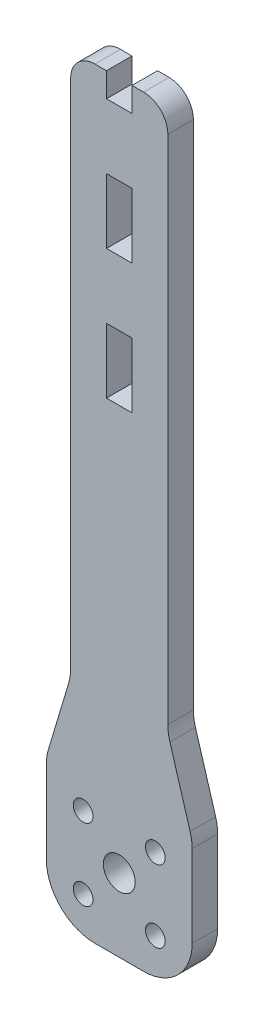
ISO-10303-21;
HEADER;
FILE_DESCRIPTION(('STEP AP214'),'2;1');
FILE_NAME('part.step','',(''),(''),'','','');
FILE_SCHEMA(('AUTOMOTIVE_DESIGN { 1 0 10303 214 1 1 1 1 }'));
ENDSEC;
DATA;
#1=APPLICATION_CONTEXT('core data for automotive mechanical design processes');
#2=APPLICATION_PROTOCOL_DEFINITION('international standard','automotive_design',2000,#1);
#3=PRODUCT_CONTEXT('',#1,'mechanical');
#4=PRODUCT('Part','Part','',(#3));
#5=PRODUCT_RELATED_PRODUCT_CATEGORY('part','',(#4));
#6=PRODUCT_DEFINITION_FORMATION('','',#4);
#7=PRODUCT_DEFINITION_CONTEXT('part definition',#1,'design');
#8=PRODUCT_DEFINITION('design','',#6,#7);
#9=PRODUCT_DEFINITION_SHAPE('','',#8);
#10=(LENGTH_UNIT() NAMED_UNIT(*) SI_UNIT(.MILLI.,.METRE.));
#11=(NAMED_UNIT(*) PLANE_ANGLE_UNIT() SI_UNIT($,.RADIAN.));
#12=(NAMED_UNIT(*) SI_UNIT($,.STERADIAN.) SOLID_ANGLE_UNIT());
#13=UNCERTAINTY_MEASURE_WITH_UNIT(LENGTH_MEASURE(1.E-05),#10,'distance_accuracy_value','');
#14=(GEOMETRIC_REPRESENTATION_CONTEXT(3) GLOBAL_UNCERTAINTY_ASSIGNED_CONTEXT((#13)) GLOBAL_UNIT_ASSIGNED_CONTEXT((#10,
#11,#12)) REPRESENTATION_CONTEXT('',''));
#15=CARTESIAN_POINT('',(0.,0.,0.));
#16=DIRECTION('',(0.,0.,1.));
#17=DIRECTION('',(1.,0.,0.));
#18=AXIS2_PLACEMENT_3D('',#15,#16,#17);
#19=CARTESIAN_POINT('',(-1.81,10.16,4.));
#20=DIRECTION('',(0.,0.,1.));
#21=DIRECTION('',(1.,0.,0.));
#22=AXIS2_PLACEMENT_3D('',#19,#20,#21);
#23=PLANE('',#22);
#24=CARTESIAN_POINT('',(-3.65685424949238,-99.6368542494924,4.));
#25=DIRECTION('',(0.,0.,1.));
#26=DIRECTION('',(1.,0.,0.));
#27=AXIS2_PLACEMENT_3D('',#24,#25,#26);
#28=CIRCLE('',#27,1.54999999999999);
#29=CARTESIAN_POINT('',(-2.10685424949239,-99.6368542494924,4.));
#30=VERTEX_POINT('',#29);
#31=EDGE_CURVE('E938',#30,#30,#28,.T.);
#32=ORIENTED_EDGE('',*,*,#31,.F.);
#33=EDGE_LOOP('',(#32));
#34=FACE_BOUND('',#33,.T.);
#35=CARTESIAN_POINT('',(7.65685424949238,-88.3231457505076,4.));
#36=DIRECTION('',(0.,0.,1.));
#37=DIRECTION('',(1.,0.,0.));
#38=AXIS2_PLACEMENT_3D('',#35,#36,#37);
#39=CIRCLE('',#38,1.54999999999999);
#40=CARTESIAN_POINT('',(9.20685424949236,-88.3231457505076,4.));
#41=VERTEX_POINT('',#40);
#42=EDGE_CURVE('E954',#41,#41,#39,.T.);
#43=ORIENTED_EDGE('',*,*,#42,.F.);
#44=EDGE_LOOP('',(#43));
#45=FACE_BOUND('',#44,.T.);
#46=DIRECTION('',(1.,0.,0.));
#47=VECTOR('',#46,1.);
#48=CARTESIAN_POINT('',(0.,-30.48,4.));
#49=LINE('',#48,#47);
#50=CARTESIAN_POINT('',(0.,-30.48,4.));
#51=VERTEX_POINT('',#50);
#52=CARTESIAN_POINT('',(4.,-30.48,4.));
#53=VERTEX_POINT('',#52);
#54=EDGE_CURVE('E240',#51,#53,#49,.T.);
#55=ORIENTED_EDGE('',*,*,#54,.F.);
#56=DIRECTION('',(0.,-1.,0.));
#57=VECTOR('',#56,1.);
#58=CARTESIAN_POINT('',(0.,-20.32,4.));
#59=LINE('',#58,#57);
#60=CARTESIAN_POINT('',(0.,-20.32,4.));
#61=VERTEX_POINT('',#60);
#62=EDGE_CURVE('E231',#61,#51,#59,.T.);
#63=ORIENTED_EDGE('',*,*,#62,.F.);
#64=DIRECTION('',(-1.,0.,0.));
#65=VECTOR('',#64,1.);
#66=CARTESIAN_POINT('',(0.,-20.32,4.));
#67=LINE('',#66,#65);
#68=CARTESIAN_POINT('',(4.,-20.32,4.));
#69=VERTEX_POINT('',#68);
#70=EDGE_CURVE('E258',#69,#61,#67,.T.);
#71=ORIENTED_EDGE('',*,*,#70,.F.);
#72=DIRECTION('',(0.,1.,0.));
#73=VECTOR('',#72,1.);
#74=CARTESIAN_POINT('',(4.,-20.32,4.));
#75=LINE('',#74,#73);
#76=EDGE_CURVE('E254',#53,#69,#75,.T.);
#77=ORIENTED_EDGE('',*,*,#76,.F.);
#78=EDGE_LOOP('',(#55,#63,#71,#77));
#79=FACE_BOUND('',#78,.T.);
#80=DIRECTION('',(1.,0.,0.));
#81=VECTOR('',#80,1.);
#82=CARTESIAN_POINT('',(0.,-10.16,4.));
#83=LINE('',#82,#81);
#84=CARTESIAN_POINT('',(0.,-10.16,4.));
#85=VERTEX_POINT('',#84);
#86=CARTESIAN_POINT('',(4.,-10.16,4.));
#87=VERTEX_POINT('',#86);
#88=EDGE_CURVE('E285',#85,#87,#83,.T.);
#89=ORIENTED_EDGE('',*,*,#88,.F.);
#90=DIRECTION('',(0.,-1.,0.));
#91=VECTOR('',#90,1.);
#92=CARTESIAN_POINT('',(0.,0.,4.));
#93=LINE('',#92,#91);
#94=CARTESIAN_POINT('',(0.,0.,4.));
#95=VERTEX_POINT('',#94);
#96=EDGE_CURVE('E282',#95,#85,#93,.T.);
#97=ORIENTED_EDGE('',*,*,#96,.F.);
#98=DIRECTION('',(-1.,0.,0.));
#99=VECTOR('',#98,1.);
#100=CARTESIAN_POINT('',(0.,0.,4.));
#101=LINE('',#100,#99);
#102=CARTESIAN_POINT('',(4.,0.,4.));
#103=VERTEX_POINT('',#102);
#104=EDGE_CURVE('E293',#103,#95,#101,.T.);
#105=ORIENTED_EDGE('',*,*,#104,.F.);
#106=DIRECTION('',(0.,1.,0.));
#107=VECTOR('',#106,1.);
#108=CARTESIAN_POINT('',(4.,0.,4.));
#109=LINE('',#108,#107);
#110=EDGE_CURVE('E289',#87,#103,#109,.T.);
#111=ORIENTED_EDGE('',*,*,#110,.F.);
#112=EDGE_LOOP('',(#89,#97,#105,#111));
#113=FACE_BOUND('',#112,.T.);
#114=DIRECTION('',(0.,1.,0.));
#115=VECTOR('',#114,1.);
#116=CARTESIAN_POINT('',(0.,10.16,4.));
#117=LINE('',#116,#115);
#118=CARTESIAN_POINT('',(0.,10.16,4.));
#119=VERTEX_POINT('',#118);
#120=CARTESIAN_POINT('',(0.,13.97,4.));
#121=VERTEX_POINT('',#120);
#122=EDGE_CURVE('E325',#119,#121,#117,.T.);
#123=ORIENTED_EDGE('',*,*,#122,.T.);
#124=DIRECTION('',(-1.,0.,0.));
#125=VECTOR('',#124,1.);
#126=CARTESIAN_POINT('',(0.,13.97,4.));
#127=LINE('',#126,#125);
#128=CARTESIAN_POINT('',(-1.81,13.97,4.));
#129=VERTEX_POINT('',#128);
#130=EDGE_CURVE('E329',#121,#129,#127,.T.);
#131=ORIENTED_EDGE('',*,*,#130,.T.);
#132=CARTESIAN_POINT('',(-1.81,10.16,4.));
#133=DIRECTION('',(0.,0.,1.));
#134=DIRECTION('',(1.,0.,0.));
#135=AXIS2_PLACEMENT_3D('',#132,#133,#134);
#136=CIRCLE('',#135,3.81);
#137=CARTESIAN_POINT('',(-5.62,10.16,4.));
#138=VERTEX_POINT('',#137);
#139=EDGE_CURVE('E333',#129,#138,#136,.T.);
#140=ORIENTED_EDGE('',*,*,#139,.T.);
#141=DIRECTION('',(0.,-1.,0.));
#142=VECTOR('',#141,1.);
#143=CARTESIAN_POINT('',(-5.62,10.16,4.));
#144=LINE('',#143,#142);
#145=CARTESIAN_POINT('',(-5.62000000000001,-70.0016214673672,4.));
#146=VERTEX_POINT('',#145);
#147=EDGE_CURVE('E336',#138,#146,#144,.T.);
#148=ORIENTED_EDGE('',*,*,#147,.T.);
#149=CARTESIAN_POINT('',(-13.24,-70.0016214673672,4.));
#150=DIRECTION('',(0.,0.,-1.));
#151=DIRECTION('',(-1.,0.,0.));
#152=AXIS2_PLACEMENT_3D('',#149,#150,#151);
#153=CIRCLE('',#152,7.62);
#154=CARTESIAN_POINT('',(-5.94136370661483,-72.1912123553828,4.));
#155=VERTEX_POINT('',#154);
#156=EDGE_CURVE('E339',#146,#155,#153,.T.);
#157=ORIENTED_EDGE('',*,*,#156,.T.);
#158=DIRECTION('',(-0.287347885566345,-0.957826285221152,0.));
#159=VECTOR('',#158,1.);
#160=CARTESIAN_POINT('',(-5.94136370661483,-72.1912123553828,4.));
#161=LINE('',#160,#159);
#162=CARTESIAN_POINT('',(-9.10863629338518,-82.7487876446173,4.));
#163=VERTEX_POINT('',#162);
#164=EDGE_CURVE('E342',#155,#163,#161,.T.);
#165=ORIENTED_EDGE('',*,*,#164,.T.);
#166=CARTESIAN_POINT('',(-1.81,-84.9383785326328,4.));
#167=DIRECTION('',(0.,0.,1.));
#168=DIRECTION('',(1.,0.,0.));
#169=AXIS2_PLACEMENT_3D('',#166,#167,#168);
#170=CIRCLE('',#169,7.62);
#171=CARTESIAN_POINT('',(-9.43,-84.9383785326328,4.));
#172=VERTEX_POINT('',#171);
#173=EDGE_CURVE('E345',#163,#172,#170,.T.);
#174=ORIENTED_EDGE('',*,*,#173,.T.);
#175=DIRECTION('',(0.,-1.,0.));
#176=VECTOR('',#175,1.);
#177=CARTESIAN_POINT('',(-9.43,-84.9383785326328,4.));
#178=LINE('',#177,#176);
#179=CARTESIAN_POINT('',(-9.43,-97.79,4.));
#180=VERTEX_POINT('',#179);
#181=EDGE_CURVE('E348',#172,#180,#178,.T.);
#182=ORIENTED_EDGE('',*,*,#181,.T.);
#183=CARTESIAN_POINT('',(-1.81,-97.79,4.));
#184=DIRECTION('',(0.,0.,1.));
#185=DIRECTION('',(1.,0.,0.));
#186=AXIS2_PLACEMENT_3D('',#183,#184,#185);
#187=CIRCLE('',#186,7.62);
#188=CARTESIAN_POINT('',(-1.81,-105.41,4.));
#189=VERTEX_POINT('',#188);
#190=EDGE_CURVE('E351',#180,#189,#187,.T.);
#191=ORIENTED_EDGE('',*,*,#190,.T.);
#192=DIRECTION('',(1.,0.,0.));
#193=VECTOR('',#192,1.);
#194=CARTESIAN_POINT('',(-1.81,-105.41,4.));
#195=LINE('',#194,#193);
#196=CARTESIAN_POINT('',(5.81,-105.41,4.));
#197=VERTEX_POINT('',#196);
#198=EDGE_CURVE('E354',#189,#197,#195,.T.);
#199=ORIENTED_EDGE('',*,*,#198,.T.);
#200=CARTESIAN_POINT('',(5.81,-97.79,4.));
#201=DIRECTION('',(0.,0.,1.));
#202=DIRECTION('',(1.,0.,0.));
#203=AXIS2_PLACEMENT_3D('',#200,#201,#202);
#204=CIRCLE('',#203,7.62);
#205=CARTESIAN_POINT('',(13.43,-97.79,4.));
#206=VERTEX_POINT('',#205);
#207=EDGE_CURVE('E357',#197,#206,#204,.T.);
#208=ORIENTED_EDGE('',*,*,#207,.T.);
#209=DIRECTION('',(0.,1.,0.));
#210=VECTOR('',#209,1.);
#211=CARTESIAN_POINT('',(13.43,-97.79,4.));
#212=LINE('',#211,#210);
#213=CARTESIAN_POINT('',(13.43,-84.9383785326328,4.));
#214=VERTEX_POINT('',#213);
#215=EDGE_CURVE('E360',#206,#214,#212,.T.);
#216=ORIENTED_EDGE('',*,*,#215,.T.);
#217=CARTESIAN_POINT('',(5.81,-84.9383785326328,4.));
#218=DIRECTION('',(0.,0.,1.));
#219=DIRECTION('',(1.,0.,0.));
#220=AXIS2_PLACEMENT_3D('',#217,#218,#219);
#221=CIRCLE('',#220,7.62);
#222=CARTESIAN_POINT('',(13.1086362933852,-82.7487876446173,4.));
#223=VERTEX_POINT('',#222);
#224=EDGE_CURVE('E363',#214,#223,#221,.T.);
#225=ORIENTED_EDGE('',*,*,#224,.T.);
#226=DIRECTION('',(-0.287347885566345,0.957826285221152,0.));
#227=VECTOR('',#226,1.);
#228=CARTESIAN_POINT('',(13.1086362933852,-82.7487876446173,4.));
#229=LINE('',#228,#227);
#230=CARTESIAN_POINT('',(9.94136370661483,-72.1912123553828,4.));
#231=VERTEX_POINT('',#230);
#232=EDGE_CURVE('E366',#223,#231,#229,.T.);
#233=ORIENTED_EDGE('',*,*,#232,.T.);
#234=CARTESIAN_POINT('',(17.24,-70.0016214673672,4.));
#235=DIRECTION('',(0.,0.,-1.));
#236=DIRECTION('',(1.,0.,0.));
#237=AXIS2_PLACEMENT_3D('',#234,#235,#236);
#238=CIRCLE('',#237,7.62);
#239=CARTESIAN_POINT('',(9.62000000000001,-70.0016214673672,4.));
#240=VERTEX_POINT('',#239);
#241=EDGE_CURVE('E369',#231,#240,#238,.T.);
#242=ORIENTED_EDGE('',*,*,#241,.T.);
#243=DIRECTION('',(0.,1.,0.));
#244=VECTOR('',#243,1.);
#245=CARTESIAN_POINT('',(9.62,10.16,4.));
#246=LINE('',#245,#244);
#247=CARTESIAN_POINT('',(9.62,10.16,4.));
#248=VERTEX_POINT('',#247);
#249=EDGE_CURVE('E372',#240,#248,#246,.T.);
#250=ORIENTED_EDGE('',*,*,#249,.T.);
#251=CARTESIAN_POINT('',(5.81,10.16,4.));
#252=DIRECTION('',(0.,0.,1.));
#253=DIRECTION('',(-1.,0.,0.));
#254=AXIS2_PLACEMENT_3D('',#251,#252,#253);
#255=CIRCLE('',#254,3.81);
#256=CARTESIAN_POINT('',(5.81,13.97,4.));
#257=VERTEX_POINT('',#256);
#258=EDGE_CURVE('E375',#248,#257,#255,.T.);
#259=ORIENTED_EDGE('',*,*,#258,.T.);
#260=DIRECTION('',(-1.,0.,0.));
#261=VECTOR('',#260,1.);
#262=CARTESIAN_POINT('',(4.,13.97,4.));
#263=LINE('',#262,#261);
#264=CARTESIAN_POINT('',(4.,13.97,4.));
#265=VERTEX_POINT('',#264);
#266=EDGE_CURVE('E378',#257,#265,#263,.T.);
#267=ORIENTED_EDGE('',*,*,#266,.T.);
#268=DIRECTION('',(0.,-1.,0.));
#269=VECTOR('',#268,1.);
#270=CARTESIAN_POINT('',(4.,10.16,4.));
#271=LINE('',#270,#269);
#272=CARTESIAN_POINT('',(4.,10.16,4.));
#273=VERTEX_POINT('',#272);
#274=EDGE_CURVE('E381',#265,#273,#271,.T.);
#275=ORIENTED_EDGE('',*,*,#274,.T.);
#276=DIRECTION('',(-1.,0.,0.));
#277=VECTOR('',#276,1.);
#278=CARTESIAN_POINT('',(0.,10.16,4.));
#279=LINE('',#278,#277);
#280=EDGE_CURVE('E384',#273,#119,#279,.T.);
#281=ORIENTED_EDGE('',*,*,#280,.T.);
#282=EDGE_LOOP('',(#123,#131,#140,#148,#157,#165,#174,#182,#191,#199,#208,#216,#225,#233,#242,
#250,#259,#267,#275,#281));
#283=FACE_BOUND('',#282,.T.);
#284=CARTESIAN_POINT('',(2.,-93.98,4.));
#285=DIRECTION('',(0.,0.,1.));
#286=DIRECTION('',(1.,0.,0.));
#287=AXIS2_PLACEMENT_3D('',#284,#285,#286);
#288=CIRCLE('',#287,2.5);
#289=CARTESIAN_POINT('',(4.5,-93.98,4.));
#290=VERTEX_POINT('',#289);
#291=EDGE_CURVE('E266',#290,#290,#288,.T.);
#292=ORIENTED_EDGE('',*,*,#291,.F.);
#293=EDGE_LOOP('',(#292));
#294=FACE_BOUND('',#293,.T.);
#295=CARTESIAN_POINT('',(-3.65685424949238,-88.3231457505076,4.));
#296=DIRECTION('',(0.,0.,1.));
#297=DIRECTION('',(1.,0.,0.));
#298=AXIS2_PLACEMENT_3D('',#295,#296,#297);
#299=CIRCLE('',#298,1.54999999999999);
#300=CARTESIAN_POINT('',(-2.10685424949239,-88.3231457505076,4.));
#301=VERTEX_POINT('',#300);
#302=EDGE_CURVE('E946',#301,#301,#299,.T.);
#303=ORIENTED_EDGE('',*,*,#302,.F.);
#304=EDGE_LOOP('',(#303));
#305=FACE_BOUND('',#304,.T.);
#306=CARTESIAN_POINT('',(7.65685424949238,-99.6368542494924,4.));
#307=DIRECTION('',(0.,0.,1.));
#308=DIRECTION('',(1.,0.,0.));
#309=AXIS2_PLACEMENT_3D('',#306,#307,#308);
#310=CIRCLE('',#309,1.54999999999999);
#311=CARTESIAN_POINT('',(9.20685424949236,-99.6368542494924,4.));
#312=VERTEX_POINT('',#311);
#313=EDGE_CURVE('E927',#312,#312,#310,.T.);
#314=ORIENTED_EDGE('',*,*,#313,.F.);
#315=EDGE_LOOP('',(#314));
#316=FACE_BOUND('',#315,.T.);
#317=ADVANCED_FACE('F45',(#34,#45,#79,#113,#283,#294,#305,#316),#23,.T.);
#318=CARTESIAN_POINT('',(-1.81,10.16,0.));
#319=DIRECTION('',(0.,0.,1.));
#320=DIRECTION('',(1.,0.,0.));
#321=AXIS2_PLACEMENT_3D('',#318,#319,#320);
#322=PLANE('',#321);
#323=DIRECTION('',(0.,-1.,0.));
#324=VECTOR('',#323,1.);
#325=CARTESIAN_POINT('',(0.,0.,0.));
#326=LINE('',#325,#324);
#327=CARTESIAN_POINT('',(0.,0.,0.));
#328=VERTEX_POINT('',#327);
#329=CARTESIAN_POINT('',(0.,-10.16,0.));
#330=VERTEX_POINT('',#329);
#331=EDGE_CURVE('E249',#328,#330,#326,.T.);
#332=ORIENTED_EDGE('',*,*,#331,.T.);
#333=DIRECTION('',(1.,0.,0.));
#334=VECTOR('',#333,1.);
#335=CARTESIAN_POINT('',(0.,-10.16,0.));
#336=LINE('',#335,#334);
#337=CARTESIAN_POINT('',(4.,-10.16,0.));
#338=VERTEX_POINT('',#337);
#339=EDGE_CURVE('E300',#330,#338,#336,.T.);
#340=ORIENTED_EDGE('',*,*,#339,.T.);
#341=DIRECTION('',(0.,1.,0.));
#342=VECTOR('',#341,1.);
#343=CARTESIAN_POINT('',(4.,0.,0.));
#344=LINE('',#343,#342);
#345=CARTESIAN_POINT('',(4.,0.,0.));
#346=VERTEX_POINT('',#345);
#347=EDGE_CURVE('E304',#338,#346,#344,.T.);
#348=ORIENTED_EDGE('',*,*,#347,.T.);
#349=DIRECTION('',(-1.,0.,0.));
#350=VECTOR('',#349,1.);
#351=CARTESIAN_POINT('',(0.,0.,0.));
#352=LINE('',#351,#350);
#353=EDGE_CURVE('E286',#346,#328,#352,.T.);
#354=ORIENTED_EDGE('',*,*,#353,.T.);
#355=EDGE_LOOP('',(#332,#340,#348,#354));
#356=FACE_BOUND('',#355,.T.);
#357=DIRECTION('',(0.,1.,0.));
#358=VECTOR('',#357,1.);
#359=CARTESIAN_POINT('',(0.,10.16,0.));
#360=LINE('',#359,#358);
#361=CARTESIAN_POINT('',(0.,10.16,0.));
#362=VERTEX_POINT('',#361);
#363=CARTESIAN_POINT('',(0.,13.97,0.));
#364=VERTEX_POINT('',#363);
#365=EDGE_CURVE('E324',#362,#364,#360,.T.);
#366=ORIENTED_EDGE('',*,*,#365,.F.);
#367=DIRECTION('',(-1.,0.,0.));
#368=VECTOR('',#367,1.);
#369=CARTESIAN_POINT('',(0.,10.16,0.));
#370=LINE('',#369,#368);
#371=CARTESIAN_POINT('',(4.,10.16,0.));
#372=VERTEX_POINT('',#371);
#373=EDGE_CURVE('E330',#372,#362,#370,.T.);
#374=ORIENTED_EDGE('',*,*,#373,.F.);
#375=DIRECTION('',(0.,-1.,0.));
#376=VECTOR('',#375,1.);
#377=CARTESIAN_POINT('',(4.,10.16,0.));
#378=LINE('',#377,#376);
#379=CARTESIAN_POINT('',(4.,13.97,0.));
#380=VERTEX_POINT('',#379);
#381=EDGE_CURVE('E442',#380,#372,#378,.T.);
#382=ORIENTED_EDGE('',*,*,#381,.F.);
#383=DIRECTION('',(-1.,0.,0.));
#384=VECTOR('',#383,1.);
#385=CARTESIAN_POINT('',(4.,13.97,0.));
#386=LINE('',#385,#384);
#387=CARTESIAN_POINT('',(5.81,13.97,0.));
#388=VERTEX_POINT('',#387);
#389=EDGE_CURVE('E439',#388,#380,#386,.T.);
#390=ORIENTED_EDGE('',*,*,#389,.F.);
#391=CARTESIAN_POINT('',(5.81,10.16,0.));
#392=DIRECTION('',(0.,0.,1.));
#393=DIRECTION('',(-1.,0.,0.));
#394=AXIS2_PLACEMENT_3D('',#391,#392,#393);
#395=CIRCLE('',#394,3.81);
#396=CARTESIAN_POINT('',(9.62,10.16,0.));
#397=VERTEX_POINT('',#396);
#398=EDGE_CURVE('E436',#397,#388,#395,.T.);
#399=ORIENTED_EDGE('',*,*,#398,.F.);
#400=DIRECTION('',(0.,1.,0.));
#401=VECTOR('',#400,1.);
#402=CARTESIAN_POINT('',(9.62,10.16,0.));
#403=LINE('',#402,#401);
#404=CARTESIAN_POINT('',(9.62000000000001,-70.0016214673672,0.));
#405=VERTEX_POINT('',#404);
#406=EDGE_CURVE('E433',#405,#397,#403,.T.);
#407=ORIENTED_EDGE('',*,*,#406,.F.);
#408=CARTESIAN_POINT('',(17.24,-70.0016214673672,0.));
#409=DIRECTION('',(0.,0.,-1.));
#410=DIRECTION('',(1.,0.,0.));
#411=AXIS2_PLACEMENT_3D('',#408,#409,#410);
#412=CIRCLE('',#411,7.62);
#413=CARTESIAN_POINT('',(9.94136370661483,-72.1912123553828,0.));
#414=VERTEX_POINT('',#413);
#415=EDGE_CURVE('E430',#414,#405,#412,.T.);
#416=ORIENTED_EDGE('',*,*,#415,.F.);
#417=DIRECTION('',(-0.287347885566345,0.957826285221152,0.));
#418=VECTOR('',#417,1.);
#419=CARTESIAN_POINT('',(13.1086362933852,-82.7487876446173,0.));
#420=LINE('',#419,#418);
#421=CARTESIAN_POINT('',(13.1086362933852,-82.7487876446173,0.));
#422=VERTEX_POINT('',#421);
#423=EDGE_CURVE('E427',#422,#414,#420,.T.);
#424=ORIENTED_EDGE('',*,*,#423,.F.);
#425=CARTESIAN_POINT('',(5.81,-84.9383785326328,0.));
#426=DIRECTION('',(0.,0.,1.));
#427=DIRECTION('',(1.,0.,0.));
#428=AXIS2_PLACEMENT_3D('',#425,#426,#427);
#429=CIRCLE('',#428,7.62);
#430=CARTESIAN_POINT('',(13.43,-84.9383785326328,0.));
#431=VERTEX_POINT('',#430);
#432=EDGE_CURVE('E424',#431,#422,#429,.T.);
#433=ORIENTED_EDGE('',*,*,#432,.F.);
#434=DIRECTION('',(0.,1.,0.));
#435=VECTOR('',#434,1.);
#436=CARTESIAN_POINT('',(13.43,-97.79,0.));
#437=LINE('',#436,#435);
#438=CARTESIAN_POINT('',(13.43,-97.79,0.));
#439=VERTEX_POINT('',#438);
#440=EDGE_CURVE('E421',#439,#431,#437,.T.);
#441=ORIENTED_EDGE('',*,*,#440,.F.);
#442=CARTESIAN_POINT('',(5.81,-97.79,0.));
#443=DIRECTION('',(0.,0.,1.));
#444=DIRECTION('',(1.,0.,0.));
#445=AXIS2_PLACEMENT_3D('',#442,#443,#444);
#446=CIRCLE('',#445,7.62);
#447=CARTESIAN_POINT('',(5.81,-105.41,0.));
#448=VERTEX_POINT('',#447);
#449=EDGE_CURVE('E418',#448,#439,#446,.T.);
#450=ORIENTED_EDGE('',*,*,#449,.F.);
#451=DIRECTION('',(1.,0.,0.));
#452=VECTOR('',#451,1.);
#453=CARTESIAN_POINT('',(-1.81,-105.41,0.));
#454=LINE('',#453,#452);
#455=CARTESIAN_POINT('',(-1.81,-105.41,0.));
#456=VERTEX_POINT('',#455);
#457=EDGE_CURVE('E415',#456,#448,#454,.T.);
#458=ORIENTED_EDGE('',*,*,#457,.F.);
#459=CARTESIAN_POINT('',(-1.81,-97.79,0.));
#460=DIRECTION('',(0.,0.,1.));
#461=DIRECTION('',(1.,0.,0.));
#462=AXIS2_PLACEMENT_3D('',#459,#460,#461);
#463=CIRCLE('',#462,7.62);
#464=CARTESIAN_POINT('',(-9.43,-97.79,0.));
#465=VERTEX_POINT('',#464);
#466=EDGE_CURVE('E412',#465,#456,#463,.T.);
#467=ORIENTED_EDGE('',*,*,#466,.F.);
#468=DIRECTION('',(0.,-1.,0.));
#469=VECTOR('',#468,1.);
#470=CARTESIAN_POINT('',(-9.43,-84.9383785326328,0.));
#471=LINE('',#470,#469);
#472=CARTESIAN_POINT('',(-9.43,-84.9383785326328,0.));
#473=VERTEX_POINT('',#472);
#474=EDGE_CURVE('E409',#473,#465,#471,.T.);
#475=ORIENTED_EDGE('',*,*,#474,.F.);
#476=CARTESIAN_POINT('',(-1.81,-84.9383785326328,0.));
#477=DIRECTION('',(0.,0.,1.));
#478=DIRECTION('',(1.,0.,0.));
#479=AXIS2_PLACEMENT_3D('',#476,#477,#478);
#480=CIRCLE('',#479,7.62);
#481=CARTESIAN_POINT('',(-9.10863629338518,-82.7487876446173,0.));
#482=VERTEX_POINT('',#481);
#483=EDGE_CURVE('E406',#482,#473,#480,.T.);
#484=ORIENTED_EDGE('',*,*,#483,.F.);
#485=DIRECTION('',(-0.287347885566345,-0.957826285221152,0.));
#486=VECTOR('',#485,1.);
#487=CARTESIAN_POINT('',(-5.94136370661483,-72.1912123553828,0.));
#488=LINE('',#487,#486);
#489=CARTESIAN_POINT('',(-5.94136370661483,-72.1912123553828,0.));
#490=VERTEX_POINT('',#489);
#491=EDGE_CURVE('E403',#490,#482,#488,.T.);
#492=ORIENTED_EDGE('',*,*,#491,.F.);
#493=CARTESIAN_POINT('',(-13.24,-70.0016214673672,0.));
#494=DIRECTION('',(0.,0.,-1.));
#495=DIRECTION('',(-1.,0.,0.));
#496=AXIS2_PLACEMENT_3D('',#493,#494,#495);
#497=CIRCLE('',#496,7.62);
#498=CARTESIAN_POINT('',(-5.62000000000001,-70.0016214673672,0.));
#499=VERTEX_POINT('',#498);
#500=EDGE_CURVE('E400',#499,#490,#497,.T.);
#501=ORIENTED_EDGE('',*,*,#500,.F.);
#502=DIRECTION('',(0.,-1.,0.));
#503=VECTOR('',#502,1.);
#504=CARTESIAN_POINT('',(-5.62,10.16,0.));
#505=LINE('',#504,#503);
#506=CARTESIAN_POINT('',(-5.62,10.16,0.));
#507=VERTEX_POINT('',#506);
#508=EDGE_CURVE('E397',#507,#499,#505,.T.);
#509=ORIENTED_EDGE('',*,*,#508,.F.);
#510=CARTESIAN_POINT('',(-1.81,10.16,0.));
#511=DIRECTION('',(0.,0.,1.));
#512=DIRECTION('',(1.,0.,0.));
#513=AXIS2_PLACEMENT_3D('',#510,#511,#512);
#514=CIRCLE('',#513,3.81);
#515=CARTESIAN_POINT('',(-1.81,13.97,0.));
#516=VERTEX_POINT('',#515);
#517=EDGE_CURVE('E394',#516,#507,#514,.T.);
#518=ORIENTED_EDGE('',*,*,#517,.F.);
#519=DIRECTION('',(-1.,0.,0.));
#520=VECTOR('',#519,1.);
#521=CARTESIAN_POINT('',(0.,13.97,0.));
#522=LINE('',#521,#520);
#523=EDGE_CURVE('E391',#364,#516,#522,.T.);
#524=ORIENTED_EDGE('',*,*,#523,.F.);
#525=EDGE_LOOP('',(#366,#374,#382,#390,#399,#407,#416,#424,#433,#441,#450,#458,#467,#475,#484,
#492,#501,#509,#518,#524));
#526=FACE_BOUND('',#525,.T.);
#527=DIRECTION('',(0.,-1.,0.));
#528=VECTOR('',#527,1.);
#529=CARTESIAN_POINT('',(0.,-20.32,0.));
#530=LINE('',#529,#528);
#531=CARTESIAN_POINT('',(0.,-20.32,0.));
#532=VERTEX_POINT('',#531);
#533=CARTESIAN_POINT('',(0.,-30.48,0.));
#534=VERTEX_POINT('',#533);
#535=EDGE_CURVE('E69',#532,#534,#530,.T.);
#536=ORIENTED_EDGE('',*,*,#535,.T.);
#537=DIRECTION('',(1.,0.,0.));
#538=VECTOR('',#537,1.);
#539=CARTESIAN_POINT('',(0.,-30.48,0.));
#540=LINE('',#539,#538);
#541=CARTESIAN_POINT('',(4.,-30.48,0.));
#542=VERTEX_POINT('',#541);
#543=EDGE_CURVE('E247',#534,#542,#540,.T.);
#544=ORIENTED_EDGE('',*,*,#543,.T.);
#545=DIRECTION('',(0.,1.,0.));
#546=VECTOR('',#545,1.);
#547=CARTESIAN_POINT('',(4.,-20.32,0.));
#548=LINE('',#547,#546);
#549=CARTESIAN_POINT('',(4.,-20.32,0.));
#550=VERTEX_POINT('',#549);
#551=EDGE_CURVE('E269',#542,#550,#548,.T.);
#552=ORIENTED_EDGE('',*,*,#551,.T.);
#553=DIRECTION('',(-1.,0.,0.));
#554=VECTOR('',#553,1.);
#555=CARTESIAN_POINT('',(0.,-20.32,0.));
#556=LINE('',#555,#554);
#557=EDGE_CURVE('E241',#550,#532,#556,.T.);
#558=ORIENTED_EDGE('',*,*,#557,.T.);
#559=EDGE_LOOP('',(#536,#544,#552,#558));
#560=FACE_BOUND('',#559,.T.);
#561=CARTESIAN_POINT('',(2.,-93.98,0.));
#562=DIRECTION('',(0.,0.,1.));
#563=DIRECTION('',(1.,0.,0.));
#564=AXIS2_PLACEMENT_3D('',#561,#562,#563);
#565=CIRCLE('',#564,2.5);
#566=CARTESIAN_POINT('',(4.5,-93.98,0.));
#567=VERTEX_POINT('',#566);
#568=EDGE_CURVE('E958',#567,#567,#565,.T.);
#569=ORIENTED_EDGE('',*,*,#568,.T.);
#570=EDGE_LOOP('',(#569));
#571=FACE_BOUND('',#570,.T.);
#572=CARTESIAN_POINT('',(7.65685424949238,-88.3231457505076,0.));
#573=DIRECTION('',(0.,0.,1.));
#574=DIRECTION('',(1.,0.,0.));
#575=AXIS2_PLACEMENT_3D('',#572,#573,#574);
#576=CIRCLE('',#575,1.54999999999999);
#577=CARTESIAN_POINT('',(9.20685424949236,-88.3231457505076,0.));
#578=VERTEX_POINT('',#577);
#579=EDGE_CURVE('E950',#578,#578,#576,.T.);
#580=ORIENTED_EDGE('',*,*,#579,.T.);
#581=EDGE_LOOP('',(#580));
#582=FACE_BOUND('',#581,.T.);
#583=CARTESIAN_POINT('',(-3.65685424949238,-88.3231457505076,0.));
#584=DIRECTION('',(0.,0.,1.));
#585=DIRECTION('',(1.,0.,0.));
#586=AXIS2_PLACEMENT_3D('',#583,#584,#585);
#587=CIRCLE('',#586,1.54999999999999);
#588=CARTESIAN_POINT('',(-2.10685424949239,-88.3231457505076,0.));
#589=VERTEX_POINT('',#588);
#590=EDGE_CURVE('E942',#589,#589,#587,.T.);
#591=ORIENTED_EDGE('',*,*,#590,.T.);
#592=EDGE_LOOP('',(#591));
#593=FACE_BOUND('',#592,.T.);
#594=CARTESIAN_POINT('',(-3.65685424949238,-99.6368542494924,0.));
#595=DIRECTION('',(0.,0.,1.));
#596=DIRECTION('',(1.,0.,0.));
#597=AXIS2_PLACEMENT_3D('',#594,#595,#596);
#598=CIRCLE('',#597,1.54999999999999);
#599=CARTESIAN_POINT('',(-2.10685424949239,-99.6368542494924,0.));
#600=VERTEX_POINT('',#599);
#601=EDGE_CURVE('E935',#600,#600,#598,.T.);
#602=ORIENTED_EDGE('',*,*,#601,.T.);
#603=EDGE_LOOP('',(#602));
#604=FACE_BOUND('',#603,.T.);
#605=CARTESIAN_POINT('',(7.65685424949238,-99.6368542494924,0.));
#606=DIRECTION('',(0.,0.,1.));
#607=DIRECTION('',(1.,0.,0.));
#608=AXIS2_PLACEMENT_3D('',#605,#606,#607);
#609=CIRCLE('',#608,1.54999999999999);
#610=CARTESIAN_POINT('',(9.20685424949236,-99.6368542494924,0.));
#611=VERTEX_POINT('',#610);
#612=EDGE_CURVE('E930',#611,#611,#609,.T.);
#613=ORIENTED_EDGE('',*,*,#612,.T.);
#614=EDGE_LOOP('',(#613));
#615=FACE_BOUND('',#614,.T.);
#616=ADVANCED_FACE('F529',(#356,#526,#560,#571,#582,#593,#604,#615),#322,.F.);
#617=CARTESIAN_POINT('',(0.,10.16,4.));
#618=DIRECTION('',(-1.,0.,0.));
#619=DIRECTION('',(0.,0.,1.));
#620=AXIS2_PLACEMENT_3D('',#617,#618,#619);
#621=PLANE('',#620);
#622=ORIENTED_EDGE('',*,*,#365,.T.);
#623=DIRECTION('',(0.,0.,-1.));
#624=VECTOR('',#623,1.);
#625=CARTESIAN_POINT('',(0.,13.97,4.));
#626=LINE('',#625,#624);
#627=EDGE_CURVE('E11',#121,#364,#626,.T.);
#628=ORIENTED_EDGE('',*,*,#627,.F.);
#629=ORIENTED_EDGE('',*,*,#122,.F.);
#630=DIRECTION('',(0.,0.,-1.));
#631=VECTOR('',#630,1.);
#632=CARTESIAN_POINT('',(0.,10.16,4.));
#633=LINE('',#632,#631);
#634=EDGE_CURVE('E387',#119,#362,#633,.T.);
#635=ORIENTED_EDGE('',*,*,#634,.T.);
#636=EDGE_LOOP('',(#622,#628,#629,#635));
#637=FACE_BOUND('',#636,.T.);
#638=ADVANCED_FACE('F47',(#637),#621,.F.);
#639=CARTESIAN_POINT('',(0.,13.97,4.));
#640=DIRECTION('',(0.,-1.,0.));
#641=DIRECTION('',(0.,0.,-1.));
#642=AXIS2_PLACEMENT_3D('',#639,#640,#641);
#643=PLANE('',#642);
#644=ORIENTED_EDGE('',*,*,#523,.T.);
#645=DIRECTION('',(0.,0.,-1.));
#646=VECTOR('',#645,1.);
#647=CARTESIAN_POINT('',(-1.81,13.97,4.));
#648=LINE('',#647,#646);
#649=EDGE_CURVE('E54',#129,#516,#648,.T.);
#650=ORIENTED_EDGE('',*,*,#649,.F.);
#651=ORIENTED_EDGE('',*,*,#130,.F.);
#652=ORIENTED_EDGE('',*,*,#627,.T.);
#653=EDGE_LOOP('',(#644,#650,#651,#652));
#654=FACE_BOUND('',#653,.T.);
#655=ADVANCED_FACE('F547',(#654),#643,.F.);
#656=CARTESIAN_POINT('',(-1.81,10.16,4.));
#657=DIRECTION('',(0.,0.,-1.));
#658=DIRECTION('',(-1.,0.,0.));
#659=AXIS2_PLACEMENT_3D('',#656,#657,#658);
#660=CYLINDRICAL_SURFACE('',#659,3.81);
#661=ORIENTED_EDGE('',*,*,#517,.T.);
#662=DIRECTION('',(0.,0.,-1.));
#663=VECTOR('',#662,1.);
#664=CARTESIAN_POINT('',(-5.62,10.16,4.));
#665=LINE('',#664,#663);
#666=EDGE_CURVE('E514',#138,#507,#665,.T.);
#667=ORIENTED_EDGE('',*,*,#666,.F.);
#668=ORIENTED_EDGE('',*,*,#139,.F.);
#669=ORIENTED_EDGE('',*,*,#649,.T.);
#670=EDGE_LOOP('',(#661,#667,#668,#669));
#671=FACE_BOUND('',#670,.T.);
#672=ADVANCED_FACE('F523',(#671),#660,.T.);
#673=CARTESIAN_POINT('',(-5.62,10.16,4.));
#674=DIRECTION('',(1.,0.,0.));
#675=DIRECTION('',(0.,1.,0.));
#676=AXIS2_PLACEMENT_3D('',#673,#674,#675);
#677=PLANE('',#676);
#678=ORIENTED_EDGE('',*,*,#508,.T.);
#679=DIRECTION('',(0.,0.,-1.));
#680=VECTOR('',#679,1.);
#681=CARTESIAN_POINT('',(-5.62000000000001,-70.0016214673672,4.));
#682=LINE('',#681,#680);
#683=EDGE_CURVE('E510',#146,#499,#682,.T.);
#684=ORIENTED_EDGE('',*,*,#683,.F.);
#685=ORIENTED_EDGE('',*,*,#147,.F.);
#686=ORIENTED_EDGE('',*,*,#666,.T.);
#687=EDGE_LOOP('',(#678,#684,#685,#686));
#688=FACE_BOUND('',#687,.T.);
#689=ADVANCED_FACE('F535',(#688),#677,.F.);
#690=CARTESIAN_POINT('',(-13.24,-70.0016214673672,4.));
#691=DIRECTION('',(0.,0.,-1.));
#692=DIRECTION('',(-1.,0.,0.));
#693=AXIS2_PLACEMENT_3D('',#690,#691,#692);
#694=CYLINDRICAL_SURFACE('',#693,7.62);
#695=ORIENTED_EDGE('',*,*,#500,.T.);
#696=DIRECTION('',(0.,0.,-1.));
#697=VECTOR('',#696,1.);
#698=CARTESIAN_POINT('',(-5.94136370661483,-72.1912123553828,4.));
#699=LINE('',#698,#697);
#700=EDGE_CURVE('E506',#155,#490,#699,.T.);
#701=ORIENTED_EDGE('',*,*,#700,.F.);
#702=ORIENTED_EDGE('',*,*,#156,.F.);
#703=ORIENTED_EDGE('',*,*,#683,.T.);
#704=EDGE_LOOP('',(#695,#701,#702,#703));
#705=FACE_BOUND('',#704,.T.);
#706=ADVANCED_FACE('F539',(#705),#694,.F.);
#707=CARTESIAN_POINT('',(-5.94136370661483,-72.1912123553828,4.));
#708=DIRECTION('',(0.957826285221152,-0.287347885566345,0.));
#709=DIRECTION('',(0.287347885566345,0.957826285221152,0.));
#710=AXIS2_PLACEMENT_3D('',#707,#708,#709);
#711=PLANE('',#710);
#712=ORIENTED_EDGE('',*,*,#491,.T.);
#713=DIRECTION('',(0.,0.,-1.));
#714=VECTOR('',#713,1.);
#715=CARTESIAN_POINT('',(-9.10863629338518,-82.7487876446173,4.));
#716=LINE('',#715,#714);
#717=EDGE_CURVE('E502',#163,#482,#716,.T.);
#718=ORIENTED_EDGE('',*,*,#717,.F.);
#719=ORIENTED_EDGE('',*,*,#164,.F.);
#720=ORIENTED_EDGE('',*,*,#700,.T.);
#721=EDGE_LOOP('',(#712,#718,#719,#720));
#722=FACE_BOUND('',#721,.T.);
#723=ADVANCED_FACE('F620',(#722),#711,.F.);
#724=CARTESIAN_POINT('',(-1.81,-84.9383785326328,4.));
#725=DIRECTION('',(0.,0.,-1.));
#726=DIRECTION('',(-1.,0.,0.));
#727=AXIS2_PLACEMENT_3D('',#724,#725,#726);
#728=CYLINDRICAL_SURFACE('',#727,7.62);
#729=ORIENTED_EDGE('',*,*,#483,.T.);
#730=DIRECTION('',(0.,0.,-1.));
#731=VECTOR('',#730,1.);
#732=CARTESIAN_POINT('',(-9.43,-84.9383785326328,4.));
#733=LINE('',#732,#731);
#734=EDGE_CURVE('E498',#172,#473,#733,.T.);
#735=ORIENTED_EDGE('',*,*,#734,.F.);
#736=ORIENTED_EDGE('',*,*,#173,.F.);
#737=ORIENTED_EDGE('',*,*,#717,.T.);
#738=EDGE_LOOP('',(#729,#735,#736,#737));
#739=FACE_BOUND('',#738,.T.);
#740=ADVANCED_FACE('F618',(#739),#728,.T.);
#741=CARTESIAN_POINT('',(-9.43,-84.9383785326328,4.));
#742=DIRECTION('',(1.,0.,0.));
#743=DIRECTION('',(0.,1.,0.));
#744=AXIS2_PLACEMENT_3D('',#741,#742,#743);
#745=PLANE('',#744);
#746=ORIENTED_EDGE('',*,*,#474,.T.);
#747=DIRECTION('',(0.,0.,-1.));
#748=VECTOR('',#747,1.);
#749=CARTESIAN_POINT('',(-9.43,-97.79,4.));
#750=LINE('',#749,#748);
#751=EDGE_CURVE('E494',#180,#465,#750,.T.);
#752=ORIENTED_EDGE('',*,*,#751,.F.);
#753=ORIENTED_EDGE('',*,*,#181,.F.);
#754=ORIENTED_EDGE('',*,*,#734,.T.);
#755=EDGE_LOOP('',(#746,#752,#753,#754));
#756=FACE_BOUND('',#755,.T.);
#757=ADVANCED_FACE('F613',(#756),#745,.F.);
#758=CARTESIAN_POINT('',(-1.81,-97.79,4.));
#759=DIRECTION('',(0.,0.,-1.));
#760=DIRECTION('',(-1.,0.,0.));
#761=AXIS2_PLACEMENT_3D('',#758,#759,#760);
#762=CYLINDRICAL_SURFACE('',#761,7.62);
#763=ORIENTED_EDGE('',*,*,#466,.T.);
#764=DIRECTION('',(0.,0.,-1.));
#765=VECTOR('',#764,1.);
#766=CARTESIAN_POINT('',(-1.81,-105.41,4.));
#767=LINE('',#766,#765);
#768=EDGE_CURVE('E490',#189,#456,#767,.T.);
#769=ORIENTED_EDGE('',*,*,#768,.F.);
#770=ORIENTED_EDGE('',*,*,#190,.F.);
#771=ORIENTED_EDGE('',*,*,#751,.T.);
#772=EDGE_LOOP('',(#763,#769,#770,#771));
#773=FACE_BOUND('',#772,.T.);
#774=ADVANCED_FACE('F608',(#773),#762,.T.);
#775=CARTESIAN_POINT('',(-1.81,-105.41,4.));
#776=DIRECTION('',(0.,1.,0.));
#777=DIRECTION('',(0.,0.,1.));
#778=AXIS2_PLACEMENT_3D('',#775,#776,#777);
#779=PLANE('',#778);
#780=ORIENTED_EDGE('',*,*,#457,.T.);
#781=DIRECTION('',(0.,0.,-1.));
#782=VECTOR('',#781,1.);
#783=CARTESIAN_POINT('',(5.81,-105.41,4.));
#784=LINE('',#783,#782);
#785=EDGE_CURVE('E486',#197,#448,#784,.T.);
#786=ORIENTED_EDGE('',*,*,#785,.F.);
#787=ORIENTED_EDGE('',*,*,#198,.F.);
#788=ORIENTED_EDGE('',*,*,#768,.T.);
#789=EDGE_LOOP('',(#780,#786,#787,#788));
#790=FACE_BOUND('',#789,.T.);
#791=ADVANCED_FACE('F604',(#790),#779,.F.);
#792=CARTESIAN_POINT('',(5.81,-97.79,4.));
#793=DIRECTION('',(0.,0.,-1.));
#794=DIRECTION('',(-1.,0.,0.));
#795=AXIS2_PLACEMENT_3D('',#792,#793,#794);
#796=CYLINDRICAL_SURFACE('',#795,7.62);
#797=ORIENTED_EDGE('',*,*,#449,.T.);
#798=DIRECTION('',(0.,0.,-1.));
#799=VECTOR('',#798,1.);
#800=CARTESIAN_POINT('',(13.43,-97.79,4.));
#801=LINE('',#800,#799);
#802=EDGE_CURVE('E482',#206,#439,#801,.T.);
#803=ORIENTED_EDGE('',*,*,#802,.F.);
#804=ORIENTED_EDGE('',*,*,#207,.F.);
#805=ORIENTED_EDGE('',*,*,#785,.T.);
#806=EDGE_LOOP('',(#797,#803,#804,#805));
#807=FACE_BOUND('',#806,.T.);
#808=ADVANCED_FACE('F599',(#807),#796,.T.);
#809=CARTESIAN_POINT('',(13.43,-97.79,4.));
#810=DIRECTION('',(-1.,0.,0.));
#811=DIRECTION('',(0.,-1.,0.));
#812=AXIS2_PLACEMENT_3D('',#809,#810,#811);
#813=PLANE('',#812);
#814=ORIENTED_EDGE('',*,*,#440,.T.);
#815=DIRECTION('',(0.,0.,-1.));
#816=VECTOR('',#815,1.);
#817=CARTESIAN_POINT('',(13.43,-84.9383785326328,4.));
#818=LINE('',#817,#816);
#819=EDGE_CURVE('E478',#214,#431,#818,.T.);
#820=ORIENTED_EDGE('',*,*,#819,.F.);
#821=ORIENTED_EDGE('',*,*,#215,.F.);
#822=ORIENTED_EDGE('',*,*,#802,.T.);
#823=EDGE_LOOP('',(#814,#820,#821,#822));
#824=FACE_BOUND('',#823,.T.);
#825=ADVANCED_FACE('F593',(#824),#813,.F.);
#826=CARTESIAN_POINT('',(5.81,-84.9383785326328,4.));
#827=DIRECTION('',(0.,0.,-1.));
#828=DIRECTION('',(-1.,0.,0.));
#829=AXIS2_PLACEMENT_3D('',#826,#827,#828);
#830=CYLINDRICAL_SURFACE('',#829,7.62);
#831=ORIENTED_EDGE('',*,*,#432,.T.);
#832=DIRECTION('',(0.,0.,-1.));
#833=VECTOR('',#832,1.);
#834=CARTESIAN_POINT('',(13.1086362933852,-82.7487876446173,4.));
#835=LINE('',#834,#833);
#836=EDGE_CURVE('E474',#223,#422,#835,.T.);
#837=ORIENTED_EDGE('',*,*,#836,.F.);
#838=ORIENTED_EDGE('',*,*,#224,.F.);
#839=ORIENTED_EDGE('',*,*,#819,.T.);
#840=EDGE_LOOP('',(#831,#837,#838,#839));
#841=FACE_BOUND('',#840,.T.);
#842=ADVANCED_FACE('F589',(#841),#830,.T.);
#843=CARTESIAN_POINT('',(13.1086362933852,-82.7487876446173,4.));
#844=DIRECTION('',(-0.957826285221152,-0.287347885566345,0.));
#845=DIRECTION('',(0.287347885566345,-0.957826285221152,0.));
#846=AXIS2_PLACEMENT_3D('',#843,#844,#845);
#847=PLANE('',#846);
#848=ORIENTED_EDGE('',*,*,#423,.T.);
#849=DIRECTION('',(0.,0.,-1.));
#850=VECTOR('',#849,1.);
#851=CARTESIAN_POINT('',(9.94136370661483,-72.1912123553828,4.));
#852=LINE('',#851,#850);
#853=EDGE_CURVE('E470',#231,#414,#852,.T.);
#854=ORIENTED_EDGE('',*,*,#853,.F.);
#855=ORIENTED_EDGE('',*,*,#232,.F.);
#856=ORIENTED_EDGE('',*,*,#836,.T.);
#857=EDGE_LOOP('',(#848,#854,#855,#856));
#858=FACE_BOUND('',#857,.T.);
#859=ADVANCED_FACE('F584',(#858),#847,.F.);
#860=CARTESIAN_POINT('',(17.24,-70.0016214673672,4.));
#861=DIRECTION('',(0.,0.,-1.));
#862=DIRECTION('',(-1.,0.,0.));
#863=AXIS2_PLACEMENT_3D('',#860,#861,#862);
#864=CYLINDRICAL_SURFACE('',#863,7.62);
#865=ORIENTED_EDGE('',*,*,#415,.T.);
#866=DIRECTION('',(0.,0.,-1.));
#867=VECTOR('',#866,1.);
#868=CARTESIAN_POINT('',(9.62000000000001,-70.0016214673672,4.));
#869=LINE('',#868,#867);
#870=EDGE_CURVE('E466',#240,#405,#869,.T.);
#871=ORIENTED_EDGE('',*,*,#870,.F.);
#872=ORIENTED_EDGE('',*,*,#241,.F.);
#873=ORIENTED_EDGE('',*,*,#853,.T.);
#874=EDGE_LOOP('',(#865,#871,#872,#873));
#875=FACE_BOUND('',#874,.T.);
#876=ADVANCED_FACE('F578',(#875),#864,.F.);
#877=CARTESIAN_POINT('',(9.62,10.16,4.));
#878=DIRECTION('',(-1.,0.,0.));
#879=DIRECTION('',(0.,-1.,0.));
#880=AXIS2_PLACEMENT_3D('',#877,#878,#879);
#881=PLANE('',#880);
#882=ORIENTED_EDGE('',*,*,#406,.T.);
#883=DIRECTION('',(0.,0.,-1.));
#884=VECTOR('',#883,1.);
#885=CARTESIAN_POINT('',(9.62,10.16,4.));
#886=LINE('',#885,#884);
#887=EDGE_CURVE('E462',#248,#397,#886,.T.);
#888=ORIENTED_EDGE('',*,*,#887,.F.);
#889=ORIENTED_EDGE('',*,*,#249,.F.);
#890=ORIENTED_EDGE('',*,*,#870,.T.);
#891=EDGE_LOOP('',(#882,#888,#889,#890));
#892=FACE_BOUND('',#891,.T.);
#893=ADVANCED_FACE('F574',(#892),#881,.F.);
#894=CARTESIAN_POINT('',(5.81,10.16,4.));
#895=DIRECTION('',(0.,0.,-1.));
#896=DIRECTION('',(-1.,0.,0.));
#897=AXIS2_PLACEMENT_3D('',#894,#895,#896);
#898=CYLINDRICAL_SURFACE('',#897,3.81);
#899=ORIENTED_EDGE('',*,*,#398,.T.);
#900=DIRECTION('',(0.,0.,-1.));
#901=VECTOR('',#900,1.);
#902=CARTESIAN_POINT('',(5.81,13.97,4.));
#903=LINE('',#902,#901);
#904=EDGE_CURVE('E458',#257,#388,#903,.T.);
#905=ORIENTED_EDGE('',*,*,#904,.F.);
#906=ORIENTED_EDGE('',*,*,#258,.F.);
#907=ORIENTED_EDGE('',*,*,#887,.T.);
#908=EDGE_LOOP('',(#899,#905,#906,#907));
#909=FACE_BOUND('',#908,.T.);
#910=ADVANCED_FACE('F569',(#909),#898,.T.);
#911=CARTESIAN_POINT('',(4.,13.97,4.));
#912=DIRECTION('',(0.,-1.,0.));
#913=DIRECTION('',(0.,0.,-1.));
#914=AXIS2_PLACEMENT_3D('',#911,#912,#913);
#915=PLANE('',#914);
#916=ORIENTED_EDGE('',*,*,#389,.T.);
#917=DIRECTION('',(0.,0.,-1.));
#918=VECTOR('',#917,1.);
#919=CARTESIAN_POINT('',(4.,13.97,4.));
#920=LINE('',#919,#918);
#921=EDGE_CURVE('E454',#265,#380,#920,.T.);
#922=ORIENTED_EDGE('',*,*,#921,.F.);
#923=ORIENTED_EDGE('',*,*,#266,.F.);
#924=ORIENTED_EDGE('',*,*,#904,.T.);
#925=EDGE_LOOP('',(#916,#922,#923,#924));
#926=FACE_BOUND('',#925,.T.);
#927=ADVANCED_FACE('F563',(#926),#915,.F.);
#928=CARTESIAN_POINT('',(4.,10.16,4.));
#929=DIRECTION('',(1.,0.,0.));
#930=DIRECTION('',(0.,1.,0.));
#931=AXIS2_PLACEMENT_3D('',#928,#929,#930);
#932=PLANE('',#931);
#933=ORIENTED_EDGE('',*,*,#381,.T.);
#934=DIRECTION('',(0.,0.,-1.));
#935=VECTOR('',#934,1.);
#936=CARTESIAN_POINT('',(4.,10.16,4.));
#937=LINE('',#936,#935);
#938=EDGE_CURVE('E450',#273,#372,#937,.T.);
#939=ORIENTED_EDGE('',*,*,#938,.F.);
#940=ORIENTED_EDGE('',*,*,#274,.F.);
#941=ORIENTED_EDGE('',*,*,#921,.T.);
#942=EDGE_LOOP('',(#933,#939,#940,#941));
#943=FACE_BOUND('',#942,.T.);
#944=ADVANCED_FACE('F559',(#943),#932,.F.);
#945=CARTESIAN_POINT('',(0.,10.16,4.));
#946=DIRECTION('',(0.,-1.,0.));
#947=DIRECTION('',(0.,0.,-1.));
#948=AXIS2_PLACEMENT_3D('',#945,#946,#947);
#949=PLANE('',#948);
#950=ORIENTED_EDGE('',*,*,#373,.T.);
#951=ORIENTED_EDGE('',*,*,#634,.F.);
#952=ORIENTED_EDGE('',*,*,#280,.F.);
#953=ORIENTED_EDGE('',*,*,#938,.T.);
#954=EDGE_LOOP('',(#950,#951,#952,#953));
#955=FACE_BOUND('',#954,.T.);
#956=ADVANCED_FACE('F554',(#955),#949,.F.);
#957=CARTESIAN_POINT('',(0.,0.,4.));
#958=DIRECTION('',(1.,0.,0.));
#959=DIRECTION('',(0.,0.,-1.));
#960=AXIS2_PLACEMENT_3D('',#957,#958,#959);
#961=PLANE('',#960);
#962=ORIENTED_EDGE('',*,*,#331,.F.);
#963=DIRECTION('',(0.,0.,-1.));
#964=VECTOR('',#963,1.);
#965=CARTESIAN_POINT('',(0.,0.,4.));
#966=LINE('',#965,#964);
#967=EDGE_CURVE('E296',#95,#328,#966,.T.);
#968=ORIENTED_EDGE('',*,*,#967,.F.);
#969=ORIENTED_EDGE('',*,*,#96,.T.);
#970=DIRECTION('',(0.,0.,-1.));
#971=VECTOR('',#970,1.);
#972=CARTESIAN_POINT('',(0.,-10.16,4.));
#973=LINE('',#972,#971);
#974=EDGE_CURVE('E320',#85,#330,#973,.T.);
#975=ORIENTED_EDGE('',*,*,#974,.T.);
#976=EDGE_LOOP('',(#962,#968,#969,#975));
#977=FACE_BOUND('',#976,.T.);
#978=ADVANCED_FACE('F640',(#977),#961,.T.);
#979=CARTESIAN_POINT('',(0.,-10.16,4.));
#980=DIRECTION('',(0.,1.,0.));
#981=DIRECTION('',(0.,0.,1.));
#982=AXIS2_PLACEMENT_3D('',#979,#980,#981);
#983=PLANE('',#982);
#984=ORIENTED_EDGE('',*,*,#339,.F.);
#985=ORIENTED_EDGE('',*,*,#974,.F.);
#986=ORIENTED_EDGE('',*,*,#88,.T.);
#987=DIRECTION('',(0.,0.,-1.));
#988=VECTOR('',#987,1.);
#989=CARTESIAN_POINT('',(4.,-10.16,4.));
#990=LINE('',#989,#988);
#991=EDGE_CURVE('E317',#87,#338,#990,.T.);
#992=ORIENTED_EDGE('',*,*,#991,.T.);
#993=EDGE_LOOP('',(#984,#985,#986,#992));
#994=FACE_BOUND('',#993,.T.);
#995=ADVANCED_FACE('F739',(#994),#983,.T.);
#996=CARTESIAN_POINT('',(4.,0.,4.));
#997=DIRECTION('',(-1.,0.,0.));
#998=DIRECTION('',(0.,0.,1.));
#999=AXIS2_PLACEMENT_3D('',#996,#997,#998);
#1000=PLANE('',#999);
#1001=ORIENTED_EDGE('',*,*,#347,.F.);
#1002=ORIENTED_EDGE('',*,*,#991,.F.);
#1003=ORIENTED_EDGE('',*,*,#110,.T.);
#1004=DIRECTION('',(0.,0.,-1.));
#1005=VECTOR('',#1004,1.);
#1006=CARTESIAN_POINT('',(4.,0.,4.));
#1007=LINE('',#1006,#1005);
#1008=EDGE_CURVE('E314',#103,#346,#1007,.T.);
#1009=ORIENTED_EDGE('',*,*,#1008,.T.);
#1010=EDGE_LOOP('',(#1001,#1002,#1003,#1009));
#1011=FACE_BOUND('',#1010,.T.);
#1012=ADVANCED_FACE('F747',(#1011),#1000,.T.);
#1013=CARTESIAN_POINT('',(0.,0.,4.));
#1014=DIRECTION('',(0.,-1.,0.));
#1015=DIRECTION('',(0.,0.,-1.));
#1016=AXIS2_PLACEMENT_3D('',#1013,#1014,#1015);
#1017=PLANE('',#1016);
#1018=ORIENTED_EDGE('',*,*,#353,.F.);
#1019=ORIENTED_EDGE('',*,*,#1008,.F.);
#1020=ORIENTED_EDGE('',*,*,#104,.T.);
#1021=ORIENTED_EDGE('',*,*,#967,.T.);
#1022=EDGE_LOOP('',(#1018,#1019,#1020,#1021));
#1023=FACE_BOUND('',#1022,.T.);
#1024=ADVANCED_FACE('F755',(#1023),#1017,.T.);
#1025=CARTESIAN_POINT('',(0.,-20.32,4.));
#1026=DIRECTION('',(1.,0.,0.));
#1027=DIRECTION('',(0.,1.,0.));
#1028=AXIS2_PLACEMENT_3D('',#1025,#1026,#1027);
#1029=PLANE('',#1028);
#1030=ORIENTED_EDGE('',*,*,#535,.F.);
#1031=DIRECTION('',(0.,0.,-1.));
#1032=VECTOR('',#1031,1.);
#1033=CARTESIAN_POINT('',(0.,-20.32,4.));
#1034=LINE('',#1033,#1032);
#1035=EDGE_CURVE('E235',#61,#532,#1034,.T.);
#1036=ORIENTED_EDGE('',*,*,#1035,.F.);
#1037=ORIENTED_EDGE('',*,*,#62,.T.);
#1038=DIRECTION('',(0.,0.,-1.));
#1039=VECTOR('',#1038,1.);
#1040=CARTESIAN_POINT('',(0.,-30.48,4.));
#1041=LINE('',#1040,#1039);
#1042=EDGE_CURVE('E234',#51,#534,#1041,.T.);
#1043=ORIENTED_EDGE('',*,*,#1042,.T.);
#1044=EDGE_LOOP('',(#1030,#1036,#1037,#1043));
#1045=FACE_BOUND('',#1044,.T.);
#1046=ADVANCED_FACE('F233',(#1045),#1029,.T.);
#1047=CARTESIAN_POINT('',(0.,-30.48,4.));
#1048=DIRECTION('',(0.,1.,0.));
#1049=DIRECTION('',(0.,0.,1.));
#1050=AXIS2_PLACEMENT_3D('',#1047,#1048,#1049);
#1051=PLANE('',#1050);
#1052=ORIENTED_EDGE('',*,*,#543,.F.);
#1053=ORIENTED_EDGE('',*,*,#1042,.F.);
#1054=ORIENTED_EDGE('',*,*,#54,.T.);
#1055=DIRECTION('',(0.,0.,-1.));
#1056=VECTOR('',#1055,1.);
#1057=CARTESIAN_POINT('',(4.,-30.48,4.));
#1058=LINE('',#1057,#1056);
#1059=EDGE_CURVE('E250',#53,#542,#1058,.T.);
#1060=ORIENTED_EDGE('',*,*,#1059,.T.);
#1061=EDGE_LOOP('',(#1052,#1053,#1054,#1060));
#1062=FACE_BOUND('',#1061,.T.);
#1063=ADVANCED_FACE('F244',(#1062),#1051,.T.);
#1064=CARTESIAN_POINT('',(4.,-20.32,4.));
#1065=DIRECTION('',(-1.,0.,0.));
#1066=DIRECTION('',(0.,-1.,0.));
#1067=AXIS2_PLACEMENT_3D('',#1064,#1065,#1066);
#1068=PLANE('',#1067);
#1069=ORIENTED_EDGE('',*,*,#551,.F.);
#1070=ORIENTED_EDGE('',*,*,#1059,.F.);
#1071=ORIENTED_EDGE('',*,*,#76,.T.);
#1072=DIRECTION('',(0.,0.,-1.));
#1073=VECTOR('',#1072,1.);
#1074=CARTESIAN_POINT('',(4.,-20.32,4.));
#1075=LINE('',#1074,#1073);
#1076=EDGE_CURVE('E61',#69,#550,#1075,.T.);
#1077=ORIENTED_EDGE('',*,*,#1076,.T.);
#1078=EDGE_LOOP('',(#1069,#1070,#1071,#1077));
#1079=FACE_BOUND('',#1078,.T.);
#1080=ADVANCED_FACE('F779',(#1079),#1068,.T.);
#1081=CARTESIAN_POINT('',(0.,-20.32,4.));
#1082=DIRECTION('',(0.,-1.,0.));
#1083=DIRECTION('',(0.,0.,-1.));
#1084=AXIS2_PLACEMENT_3D('',#1081,#1082,#1083);
#1085=PLANE('',#1084);
#1086=ORIENTED_EDGE('',*,*,#557,.F.);
#1087=ORIENTED_EDGE('',*,*,#1076,.F.);
#1088=ORIENTED_EDGE('',*,*,#70,.T.);
#1089=ORIENTED_EDGE('',*,*,#1035,.T.);
#1090=EDGE_LOOP('',(#1086,#1087,#1088,#1089));
#1091=FACE_BOUND('',#1090,.T.);
#1092=ADVANCED_FACE('F787',(#1091),#1085,.T.);
#1093=CARTESIAN_POINT('',(2.,-93.98,4.));
#1094=DIRECTION('',(0.,0.,-1.));
#1095=DIRECTION('',(-1.,0.,0.));
#1096=AXIS2_PLACEMENT_3D('',#1093,#1094,#1095);
#1097=CYLINDRICAL_SURFACE('',#1096,2.5);
#1098=ORIENTED_EDGE('',*,*,#291,.T.);
#1099=EDGE_LOOP('',(#1098));
#1100=FACE_BOUND('',#1099,.T.);
#1101=ORIENTED_EDGE('',*,*,#568,.F.);
#1102=EDGE_LOOP('',(#1101));
#1103=FACE_BOUND('',#1102,.T.);
#1104=ADVANCED_FACE('F796',(#1100,#1103),#1097,.F.);
#1105=CARTESIAN_POINT('',(7.65685424949238,-88.3231457505076,4.));
#1106=DIRECTION('',(0.,0.,-1.));
#1107=DIRECTION('',(-1.,0.,0.));
#1108=AXIS2_PLACEMENT_3D('',#1105,#1106,#1107);
#1109=CYLINDRICAL_SURFACE('',#1108,1.54999999999999);
#1110=ORIENTED_EDGE('',*,*,#42,.T.);
#1111=EDGE_LOOP('',(#1110));
#1112=FACE_BOUND('',#1111,.T.);
#1113=ORIENTED_EDGE('',*,*,#579,.F.);
#1114=EDGE_LOOP('',(#1113));
#1115=FACE_BOUND('',#1114,.T.);
#1116=ADVANCED_FACE('F804',(#1112,#1115),#1109,.F.);
#1117=CARTESIAN_POINT('',(-3.65685424949238,-88.3231457505076,4.));
#1118=DIRECTION('',(0.,0.,-1.));
#1119=DIRECTION('',(-1.,0.,0.));
#1120=AXIS2_PLACEMENT_3D('',#1117,#1118,#1119);
#1121=CYLINDRICAL_SURFACE('',#1120,1.54999999999999);
#1122=ORIENTED_EDGE('',*,*,#302,.T.);
#1123=EDGE_LOOP('',(#1122));
#1124=FACE_BOUND('',#1123,.T.);
#1125=ORIENTED_EDGE('',*,*,#590,.F.);
#1126=EDGE_LOOP('',(#1125));
#1127=FACE_BOUND('',#1126,.T.);
#1128=ADVANCED_FACE('F813',(#1124,#1127),#1121,.F.);
#1129=CARTESIAN_POINT('',(-3.65685424949238,-99.6368542494924,4.));
#1130=DIRECTION('',(0.,0.,-1.));
#1131=DIRECTION('',(-1.,0.,0.));
#1132=AXIS2_PLACEMENT_3D('',#1129,#1130,#1131);
#1133=CYLINDRICAL_SURFACE('',#1132,1.54999999999999);
#1134=ORIENTED_EDGE('',*,*,#31,.T.);
#1135=EDGE_LOOP('',(#1134));
#1136=FACE_BOUND('',#1135,.T.);
#1137=ORIENTED_EDGE('',*,*,#601,.F.);
#1138=EDGE_LOOP('',(#1137));
#1139=FACE_BOUND('',#1138,.T.);
#1140=ADVANCED_FACE('F822',(#1136,#1139),#1133,.F.);
#1141=CARTESIAN_POINT('',(7.65685424949238,-99.6368542494924,4.));
#1142=DIRECTION('',(0.,0.,-1.));
#1143=DIRECTION('',(-1.,0.,0.));
#1144=AXIS2_PLACEMENT_3D('',#1141,#1142,#1143);
#1145=CYLINDRICAL_SURFACE('',#1144,1.54999999999999);
#1146=ORIENTED_EDGE('',*,*,#313,.T.);
#1147=EDGE_LOOP('',(#1146));
#1148=FACE_BOUND('',#1147,.T.);
#1149=ORIENTED_EDGE('',*,*,#612,.F.);
#1150=EDGE_LOOP('',(#1149));
#1151=FACE_BOUND('',#1150,.T.);
#1152=ADVANCED_FACE('F831',(#1148,#1151),#1145,.F.);
#1153=CLOSED_SHELL('',(#317,#616,#638,#655,#672,#689,#706,#723,#740,#757,#774,#791,#808,#825,
#842,#859,#876,#893,#910,#927,#944,#956,#978,#995,#1012,#1024,#1046,#1063,#1080,#1092,#1104,
#1116,#1128,#1140,#1152));
#1154=MANIFOLD_SOLID_BREP('B2',#1153);
#1155=ADVANCED_BREP_SHAPE_REPRESENTATION('',(#18,#1154),#14);
#1156=SHAPE_DEFINITION_REPRESENTATION(#9,#1155);
ENDSEC;
END-ISO-10303-21;
